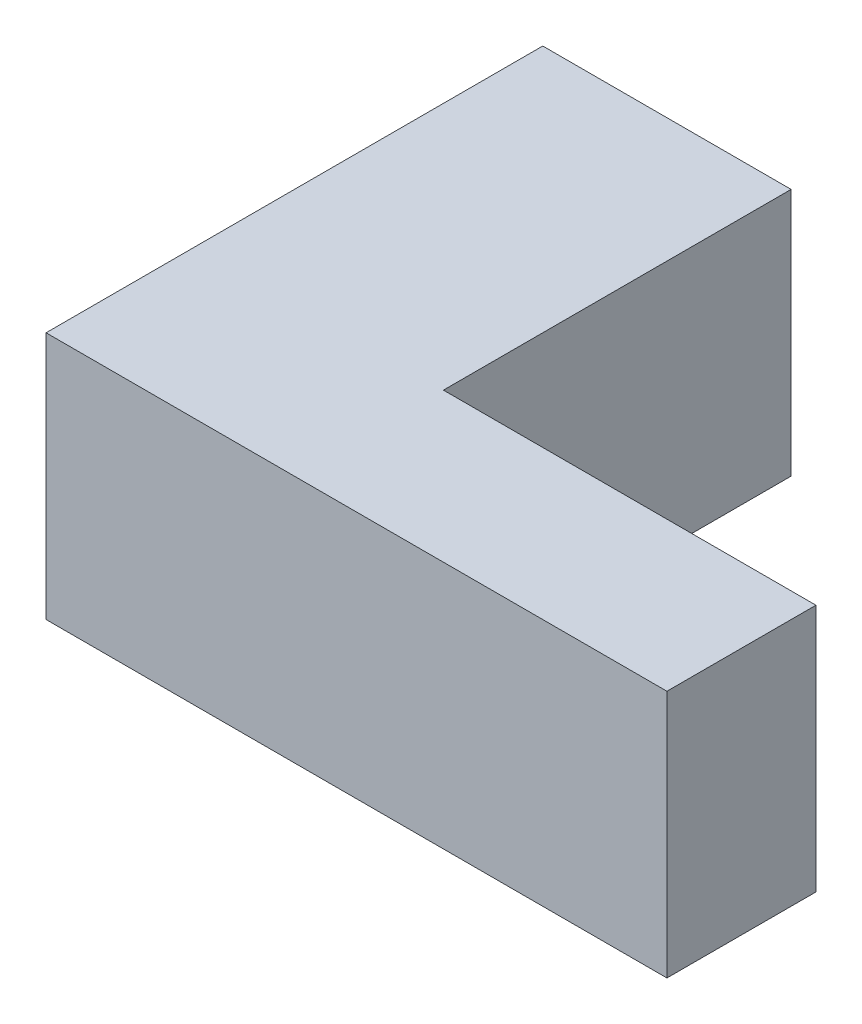
ISO-10303-21;
HEADER;
FILE_DESCRIPTION(('STEP AP214'),'2;1');
FILE_NAME('part.step','',(''),(''),'','','');
FILE_SCHEMA(('AUTOMOTIVE_DESIGN { 1 0 10303 214 1 1 1 1 }'));
ENDSEC;
DATA;
#1=APPLICATION_CONTEXT('core data for automotive mechanical design processes');
#2=APPLICATION_PROTOCOL_DEFINITION('international standard','automotive_design',2000,#1);
#3=PRODUCT_CONTEXT('',#1,'mechanical');
#4=PRODUCT('Part','Part','',(#3));
#5=PRODUCT_RELATED_PRODUCT_CATEGORY('part','',(#4));
#6=PRODUCT_DEFINITION_FORMATION('','',#4);
#7=PRODUCT_DEFINITION_CONTEXT('part definition',#1,'design');
#8=PRODUCT_DEFINITION('design','',#6,#7);
#9=PRODUCT_DEFINITION_SHAPE('','',#8);
#10=(LENGTH_UNIT() NAMED_UNIT(*) SI_UNIT(.MILLI.,.METRE.));
#11=(NAMED_UNIT(*) PLANE_ANGLE_UNIT() SI_UNIT($,.RADIAN.));
#12=(NAMED_UNIT(*) SI_UNIT($,.STERADIAN.) SOLID_ANGLE_UNIT());
#13=UNCERTAINTY_MEASURE_WITH_UNIT(LENGTH_MEASURE(1.E-05),#10,'distance_accuracy_value','');
#14=(GEOMETRIC_REPRESENTATION_CONTEXT(3) GLOBAL_UNCERTAINTY_ASSIGNED_CONTEXT((#13)) GLOBAL_UNIT_ASSIGNED_CONTEXT((#10,
#11,#12)) REPRESENTATION_CONTEXT('',''));
#15=CARTESIAN_POINT('',(0.,0.,0.));
#16=DIRECTION('',(0.,0.,1.));
#17=DIRECTION('',(1.,0.,0.));
#18=AXIS2_PLACEMENT_3D('',#15,#16,#17);
#19=CARTESIAN_POINT('',(-5.,-5.,20.));
#20=DIRECTION('',(1.,0.,0.));
#21=DIRECTION('',(0.,0.,-1.));
#22=AXIS2_PLACEMENT_3D('',#19,#20,#21);
#23=PLANE('',#22);
#24=DIRECTION('',(0.,-1.,0.));
#25=VECTOR('',#24,1.);
#26=CARTESIAN_POINT('',(-5.,-5.,0.));
#27=LINE('',#26,#25);
#28=CARTESIAN_POINT('',(-5.,5.,0.));
#29=VERTEX_POINT('',#28);
#30=CARTESIAN_POINT('',(-5.,-5.,0.));
#31=VERTEX_POINT('',#30);
#32=EDGE_CURVE('E95',#29,#31,#27,.T.);
#33=ORIENTED_EDGE('',*,*,#32,.T.);
#34=DIRECTION('',(0.,0.,-1.));
#35=VECTOR('',#34,1.);
#36=CARTESIAN_POINT('',(-5.,-5.,20.));
#37=LINE('',#36,#35);
#38=CARTESIAN_POINT('',(-5.,-5.,20.));
#39=VERTEX_POINT('',#38);
#40=EDGE_CURVE('E11',#39,#31,#37,.T.);
#41=ORIENTED_EDGE('',*,*,#40,.F.);
#42=DIRECTION('',(0.,-1.,0.));
#43=VECTOR('',#42,1.);
#44=CARTESIAN_POINT('',(-5.,-5.,20.));
#45=LINE('',#44,#43);
#46=CARTESIAN_POINT('',(-5.,5.,20.));
#47=VERTEX_POINT('',#46);
#48=EDGE_CURVE('E89',#47,#39,#45,.T.);
#49=ORIENTED_EDGE('',*,*,#48,.F.);
#50=DIRECTION('',(0.,0.,-1.));
#51=VECTOR('',#50,1.);
#52=CARTESIAN_POINT('',(-5.,5.,20.));
#53=LINE('',#52,#51);
#54=EDGE_CURVE('E80',#47,#29,#53,.T.);
#55=ORIENTED_EDGE('',*,*,#54,.T.);
#56=EDGE_LOOP('',(#33,#41,#49,#55));
#57=FACE_BOUND('',#56,.T.);
#58=ADVANCED_FACE('F33',(#57),#23,.F.);
#59=CARTESIAN_POINT('',(5.,-5.,20.));
#60=DIRECTION('',(0.,1.,0.));
#61=DIRECTION('',(-1.,0.,0.));
#62=AXIS2_PLACEMENT_3D('',#59,#60,#61);
#63=PLANE('',#62);
#64=DIRECTION('',(1.,0.,0.));
#65=VECTOR('',#64,1.);
#66=CARTESIAN_POINT('',(5.,-5.,0.));
#67=LINE('',#66,#65);
#68=CARTESIAN_POINT('',(5.,-5.,0.));
#69=VERTEX_POINT('',#68);
#70=EDGE_CURVE('E99',#31,#69,#67,.T.);
#71=ORIENTED_EDGE('',*,*,#70,.T.);
#72=DIRECTION('',(0.,0.,-1.));
#73=VECTOR('',#72,1.);
#74=CARTESIAN_POINT('',(5.,-5.,20.));
#75=LINE('',#74,#73);
#76=CARTESIAN_POINT('',(5.,-5.,14.));
#77=VERTEX_POINT('',#76);
#78=EDGE_CURVE('E41',#77,#69,#75,.T.);
#79=ORIENTED_EDGE('',*,*,#78,.F.);
#80=DIRECTION('',(-1.,0.,0.));
#81=VECTOR('',#80,1.);
#82=CARTESIAN_POINT('',(5.,-5.,14.));
#83=LINE('',#82,#81);
#84=CARTESIAN_POINT('',(20.,-5.,14.));
#85=VERTEX_POINT('',#84);
#86=EDGE_CURVE('E49',#85,#77,#83,.T.);
#87=ORIENTED_EDGE('',*,*,#86,.F.);
#88=DIRECTION('',(0.,0.,-1.));
#89=VECTOR('',#88,1.);
#90=CARTESIAN_POINT('',(20.,-5.,20.));
#91=LINE('',#90,#89);
#92=CARTESIAN_POINT('',(20.,-5.,20.));
#93=VERTEX_POINT('',#92);
#94=EDGE_CURVE('E124',#93,#85,#91,.T.);
#95=ORIENTED_EDGE('',*,*,#94,.F.);
#96=DIRECTION('',(1.,0.,0.));
#97=VECTOR('',#96,1.);
#98=CARTESIAN_POINT('',(5.,-5.,20.));
#99=LINE('',#98,#97);
#100=EDGE_CURVE('E127',#39,#93,#99,.T.);
#101=ORIENTED_EDGE('',*,*,#100,.F.);
#102=ORIENTED_EDGE('',*,*,#40,.T.);
#103=EDGE_LOOP('',(#71,#79,#87,#95,#101,#102));
#104=FACE_BOUND('',#103,.T.);
#105=ADVANCED_FACE('F143',(#104),#63,.F.);
#106=CARTESIAN_POINT('',(5.,-5.,20.));
#107=DIRECTION('',(-1.,0.,0.));
#108=DIRECTION('',(0.,0.,1.));
#109=AXIS2_PLACEMENT_3D('',#106,#107,#108);
#110=PLANE('',#109);
#111=DIRECTION('',(0.,0.,-1.));
#112=VECTOR('',#111,1.);
#113=CARTESIAN_POINT('',(5.,5.,20.));
#114=LINE('',#113,#112);
#115=CARTESIAN_POINT('',(5.,5.,14.));
#116=VERTEX_POINT('',#115);
#117=CARTESIAN_POINT('',(5.,5.,0.));
#118=VERTEX_POINT('',#117);
#119=EDGE_CURVE('E84',#116,#118,#114,.T.);
#120=ORIENTED_EDGE('',*,*,#119,.F.);
#121=DIRECTION('',(0.,-1.,0.));
#122=VECTOR('',#121,1.);
#123=CARTESIAN_POINT('',(5.,5.,14.));
#124=LINE('',#123,#122);
#125=EDGE_CURVE('E116',#116,#77,#124,.T.);
#126=ORIENTED_EDGE('',*,*,#125,.T.);
#127=ORIENTED_EDGE('',*,*,#78,.T.);
#128=DIRECTION('',(0.,1.,0.));
#129=VECTOR('',#128,1.);
#130=CARTESIAN_POINT('',(5.,-5.,0.));
#131=LINE('',#130,#129);
#132=EDGE_CURVE('E90',#69,#118,#131,.T.);
#133=ORIENTED_EDGE('',*,*,#132,.T.);
#134=EDGE_LOOP('',(#120,#126,#127,#133));
#135=FACE_BOUND('',#134,.T.);
#136=ADVANCED_FACE('F151',(#135),#110,.F.);
#137=CARTESIAN_POINT('',(5.,5.,20.));
#138=DIRECTION('',(0.,-1.,0.));
#139=DIRECTION('',(0.,0.,-1.));
#140=AXIS2_PLACEMENT_3D('',#137,#138,#139);
#141=PLANE('',#140);
#142=DIRECTION('',(-1.,0.,0.));
#143=VECTOR('',#142,1.);
#144=CARTESIAN_POINT('',(5.,5.,0.));
#145=LINE('',#144,#143);
#146=EDGE_CURVE('E77',#118,#29,#145,.T.);
#147=ORIENTED_EDGE('',*,*,#146,.T.);
#148=ORIENTED_EDGE('',*,*,#54,.F.);
#149=DIRECTION('',(-1.,0.,0.));
#150=VECTOR('',#149,1.);
#151=CARTESIAN_POINT('',(5.,5.,20.));
#152=LINE('',#151,#150);
#153=CARTESIAN_POINT('',(20.,5.,20.));
#154=VERTEX_POINT('',#153);
#155=EDGE_CURVE('E58',#154,#47,#152,.T.);
#156=ORIENTED_EDGE('',*,*,#155,.F.);
#157=DIRECTION('',(0.,0.,-1.));
#158=VECTOR('',#157,1.);
#159=CARTESIAN_POINT('',(20.,5.,20.));
#160=LINE('',#159,#158);
#161=CARTESIAN_POINT('',(20.,5.,14.));
#162=VERTEX_POINT('',#161);
#163=EDGE_CURVE('E142',#154,#162,#160,.T.);
#164=ORIENTED_EDGE('',*,*,#163,.T.);
#165=DIRECTION('',(-1.,0.,0.));
#166=VECTOR('',#165,1.);
#167=CARTESIAN_POINT('',(5.,5.,14.));
#168=LINE('',#167,#166);
#169=EDGE_CURVE('E119',#162,#116,#168,.T.);
#170=ORIENTED_EDGE('',*,*,#169,.T.);
#171=ORIENTED_EDGE('',*,*,#119,.T.);
#172=EDGE_LOOP('',(#147,#148,#156,#164,#170,#171));
#173=FACE_BOUND('',#172,.T.);
#174=ADVANCED_FACE('F79',(#173),#141,.F.);
#175=CARTESIAN_POINT('',(0.,0.,20.));
#176=DIRECTION('',(0.,0.,1.));
#177=DIRECTION('',(1.,0.,0.));
#178=AXIS2_PLACEMENT_3D('',#175,#176,#177);
#179=PLANE('',#178);
#180=ORIENTED_EDGE('',*,*,#48,.T.);
#181=ORIENTED_EDGE('',*,*,#100,.T.);
#182=DIRECTION('',(0.,-1.,0.));
#183=VECTOR('',#182,1.);
#184=CARTESIAN_POINT('',(20.,5.,20.));
#185=LINE('',#184,#183);
#186=EDGE_CURVE('E100',#154,#93,#185,.T.);
#187=ORIENTED_EDGE('',*,*,#186,.F.);
#188=ORIENTED_EDGE('',*,*,#155,.T.);
#189=EDGE_LOOP('',(#180,#181,#187,#188));
#190=FACE_BOUND('',#189,.T.);
#191=ADVANCED_FACE('F130',(#190),#179,.T.);
#192=CARTESIAN_POINT('',(0.,0.,0.));
#193=DIRECTION('',(0.,0.,1.));
#194=DIRECTION('',(1.,0.,0.));
#195=AXIS2_PLACEMENT_3D('',#192,#193,#194);
#196=PLANE('',#195);
#197=ORIENTED_EDGE('',*,*,#32,.F.);
#198=ORIENTED_EDGE('',*,*,#146,.F.);
#199=ORIENTED_EDGE('',*,*,#132,.F.);
#200=ORIENTED_EDGE('',*,*,#70,.F.);
#201=EDGE_LOOP('',(#197,#198,#199,#200));
#202=FACE_BOUND('',#201,.T.);
#203=ADVANCED_FACE('F97',(#202),#196,.F.);
#204=CARTESIAN_POINT('',(20.,5.,20.));
#205=DIRECTION('',(-1.,0.,0.));
#206=DIRECTION('',(0.,0.,1.));
#207=AXIS2_PLACEMENT_3D('',#204,#205,#206);
#208=PLANE('',#207);
#209=ORIENTED_EDGE('',*,*,#94,.T.);
#210=DIRECTION('',(0.,-1.,0.));
#211=VECTOR('',#210,1.);
#212=CARTESIAN_POINT('',(20.,5.,14.));
#213=LINE('',#212,#211);
#214=EDGE_CURVE('E104',#162,#85,#213,.T.);
#215=ORIENTED_EDGE('',*,*,#214,.F.);
#216=ORIENTED_EDGE('',*,*,#163,.F.);
#217=ORIENTED_EDGE('',*,*,#186,.T.);
#218=EDGE_LOOP('',(#209,#215,#216,#217));
#219=FACE_BOUND('',#218,.T.);
#220=ADVANCED_FACE('F139',(#219),#208,.F.);
#221=CARTESIAN_POINT('',(5.,5.,14.));
#222=DIRECTION('',(0.,0.,1.));
#223=DIRECTION('',(1.,0.,0.));
#224=AXIS2_PLACEMENT_3D('',#221,#222,#223);
#225=PLANE('',#224);
#226=ORIENTED_EDGE('',*,*,#86,.T.);
#227=ORIENTED_EDGE('',*,*,#125,.F.);
#228=ORIENTED_EDGE('',*,*,#169,.F.);
#229=ORIENTED_EDGE('',*,*,#214,.T.);
#230=EDGE_LOOP('',(#226,#227,#228,#229));
#231=FACE_BOUND('',#230,.T.);
#232=ADVANCED_FACE('F149',(#231),#225,.F.);
#233=CLOSED_SHELL('',(#58,#105,#136,#174,#191,#203,#220,#232));
#234=MANIFOLD_SOLID_BREP('B2',#233);
#235=ADVANCED_BREP_SHAPE_REPRESENTATION('',(#18,#234),#14);
#236=SHAPE_DEFINITION_REPRESENTATION(#9,#235);
ENDSEC;
END-ISO-10303-21;
